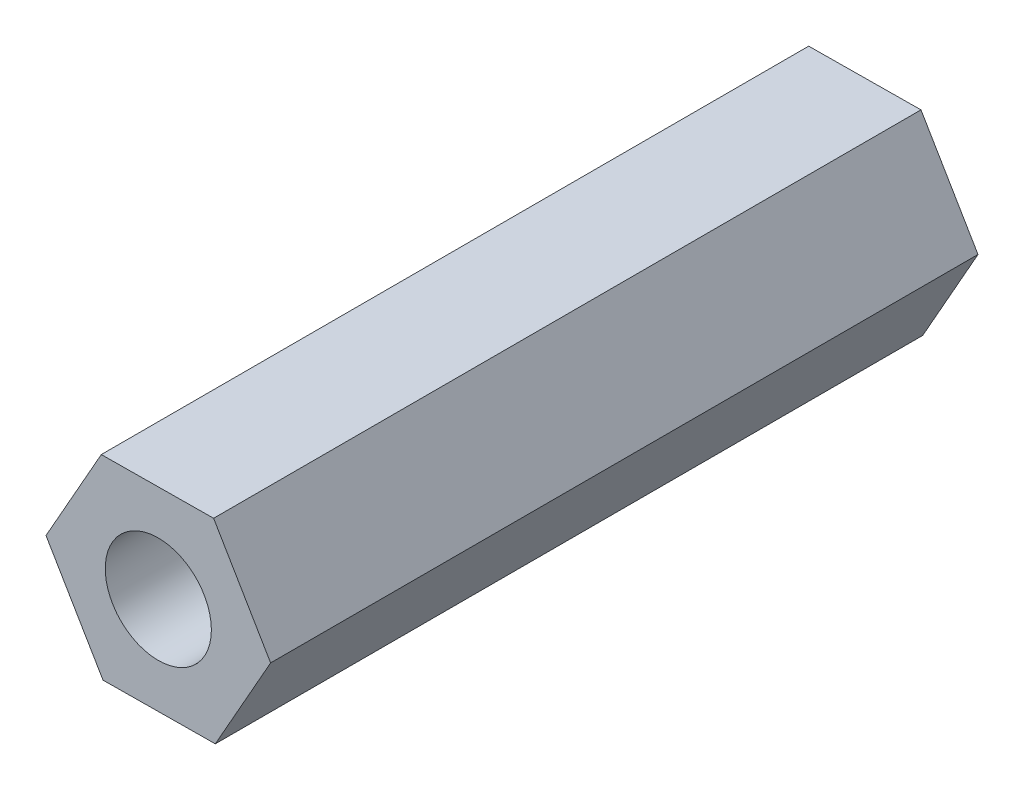
ISO-10303-21;
HEADER;
FILE_DESCRIPTION(('STEP AP214'),'2;1');
FILE_NAME('part.step','',(''),(''),'','','');
FILE_SCHEMA(('AUTOMOTIVE_DESIGN { 1 0 10303 214 1 1 1 1 }'));
ENDSEC;
DATA;
#1=APPLICATION_CONTEXT('core data for automotive mechanical design processes');
#2=APPLICATION_PROTOCOL_DEFINITION('international standard','automotive_design',2000,#1);
#3=PRODUCT_CONTEXT('',#1,'mechanical');
#4=PRODUCT('Part','Part','',(#3));
#5=PRODUCT_RELATED_PRODUCT_CATEGORY('part','',(#4));
#6=PRODUCT_DEFINITION_FORMATION('','',#4);
#7=PRODUCT_DEFINITION_CONTEXT('part definition',#1,'design');
#8=PRODUCT_DEFINITION('design','',#6,#7);
#9=PRODUCT_DEFINITION_SHAPE('','',#8);
#10=(LENGTH_UNIT() NAMED_UNIT(*) SI_UNIT(.MILLI.,.METRE.));
#11=(NAMED_UNIT(*) PLANE_ANGLE_UNIT() SI_UNIT($,.RADIAN.));
#12=(NAMED_UNIT(*) SI_UNIT($,.STERADIAN.) SOLID_ANGLE_UNIT());
#13=UNCERTAINTY_MEASURE_WITH_UNIT(LENGTH_MEASURE(1.E-05),#10,'distance_accuracy_value','');
#14=(GEOMETRIC_REPRESENTATION_CONTEXT(3) GLOBAL_UNCERTAINTY_ASSIGNED_CONTEXT((#13)) GLOBAL_UNIT_ASSIGNED_CONTEXT((#10,
#11,#12)) REPRESENTATION_CONTEXT('',''));
#15=CARTESIAN_POINT('',(0.,0.,0.));
#16=DIRECTION('',(0.,0.,1.));
#17=DIRECTION('',(1.,0.,0.));
#18=AXIS2_PLACEMENT_3D('',#15,#16,#17);
#19=CARTESIAN_POINT('',(0.,0.,20.));
#20=DIRECTION('',(0.,0.,1.));
#21=DIRECTION('',(1.,0.,0.));
#22=AXIS2_PLACEMENT_3D('',#19,#20,#21);
#23=PLANE('',#22);
#24=DIRECTION('',(0.999961257640527,0.00880245522430783,0.));
#25=VECTOR('',#24,1.);
#26=CARTESIAN_POINT('',(-1.56344497664753,-2.76386923321798,20.));
#27=LINE('',#26,#25);
#28=CARTESIAN_POINT('',(-1.56344497664753,-2.76386923321798,20.));
#29=VERTEX_POINT('',#28);
#30=CARTESIAN_POINT('',(1.61185848038122,-2.73591768380492,20.));
#31=VERTEX_POINT('',#30);
#32=EDGE_CURVE('E131',#29,#31,#27,.T.);
#33=ORIENTED_EDGE('',*,*,#32,.T.);
#34=DIRECTION('',(0.492357478980338,0.870393079529086,0.));
#35=VECTOR('',#34,1.);
#36=CARTESIAN_POINT('',(1.61185848038122,-2.73591768380492,20.));
#37=LINE('',#36,#35);
#38=CARTESIAN_POINT('',(3.17530345702875,0.0279515494130611,20.));
#39=VERTEX_POINT('',#38);
#40=EDGE_CURVE('E89',#31,#39,#37,.T.);
#41=ORIENTED_EDGE('',*,*,#40,.T.);
#42=DIRECTION('',(-0.507603778660189,0.861590624304778,0.));
#43=VECTOR('',#42,1.);
#44=CARTESIAN_POINT('',(3.17530345702875,0.0279515494130611,20.));
#45=LINE('',#44,#43);
#46=CARTESIAN_POINT('',(1.56344497664753,2.76386923321798,20.));
#47=VERTEX_POINT('',#46);
#48=EDGE_CURVE('E102',#39,#47,#45,.T.);
#49=ORIENTED_EDGE('',*,*,#48,.T.);
#50=DIRECTION('',(-0.999961257640527,-0.00880245522430783,0.));
#51=VECTOR('',#50,1.);
#52=CARTESIAN_POINT('',(1.56344497664753,2.76386923321798,20.));
#53=LINE('',#52,#51);
#54=CARTESIAN_POINT('',(-1.61185848038122,2.73591768380492,20.));
#55=VERTEX_POINT('',#54);
#56=EDGE_CURVE('E96',#47,#55,#53,.T.);
#57=ORIENTED_EDGE('',*,*,#56,.T.);
#58=DIRECTION('',(-0.492357478980338,-0.870393079529086,0.));
#59=VECTOR('',#58,1.);
#60=CARTESIAN_POINT('',(-1.61185848038122,2.73591768380492,20.));
#61=LINE('',#60,#59);
#62=CARTESIAN_POINT('',(-3.17530345702875,-0.02795154941306,20.));
#63=VERTEX_POINT('',#62);
#64=EDGE_CURVE('E100',#55,#63,#61,.T.);
#65=ORIENTED_EDGE('',*,*,#64,.T.);
#66=DIRECTION('',(0.507603778660189,-0.861590624304779,0.));
#67=VECTOR('',#66,1.);
#68=CARTESIAN_POINT('',(-3.17530345702875,-0.02795154941306,20.));
#69=LINE('',#68,#67);
#70=EDGE_CURVE('E52',#63,#29,#69,.T.);
#71=ORIENTED_EDGE('',*,*,#70,.T.);
#72=EDGE_LOOP('',(#33,#41,#49,#57,#65,#71));
#73=FACE_BOUND('',#72,.T.);
#74=CARTESIAN_POINT('',(0.,0.,20.));
#75=DIRECTION('',(0.,0.,1.));
#76=DIRECTION('',(1.,0.,0.));
#77=AXIS2_PLACEMENT_3D('',#74,#75,#76);
#78=CIRCLE('',#77,1.5);
#79=CARTESIAN_POINT('',(1.5,0.,20.));
#80=VERTEX_POINT('',#79);
#81=EDGE_CURVE('E124',#80,#80,#78,.T.);
#82=ORIENTED_EDGE('',*,*,#81,.F.);
#83=EDGE_LOOP('',(#82));
#84=FACE_BOUND('',#83,.T.);
#85=ADVANCED_FACE('F35',(#73,#84),#23,.T.);
#86=CARTESIAN_POINT('',(0.,0.,0.));
#87=DIRECTION('',(0.,0.,1.));
#88=DIRECTION('',(1.,0.,0.));
#89=AXIS2_PLACEMENT_3D('',#86,#87,#88);
#90=PLANE('',#89);
#91=DIRECTION('',(0.999961257640527,0.00880245522430783,0.));
#92=VECTOR('',#91,1.);
#93=CARTESIAN_POINT('',(-1.56344497664753,-2.76386923321798,0.));
#94=LINE('',#93,#92);
#95=CARTESIAN_POINT('',(-1.56344497664753,-2.76386923321798,0.));
#96=VERTEX_POINT('',#95);
#97=CARTESIAN_POINT('',(1.61185848038122,-2.73591768380492,0.));
#98=VERTEX_POINT('',#97);
#99=EDGE_CURVE('E120',#96,#98,#94,.T.);
#100=ORIENTED_EDGE('',*,*,#99,.F.);
#101=DIRECTION('',(0.507603778660189,-0.861590624304779,0.));
#102=VECTOR('',#101,1.);
#103=CARTESIAN_POINT('',(-3.17530345702875,-0.02795154941306,0.));
#104=LINE('',#103,#102);
#105=CARTESIAN_POINT('',(-3.17530345702875,-0.02795154941306,0.));
#106=VERTEX_POINT('',#105);
#107=EDGE_CURVE('E81',#106,#96,#104,.T.);
#108=ORIENTED_EDGE('',*,*,#107,.F.);
#109=DIRECTION('',(-0.492357478980338,-0.870393079529086,0.));
#110=VECTOR('',#109,1.);
#111=CARTESIAN_POINT('',(-1.61185848038122,2.73591768380492,0.));
#112=LINE('',#111,#110);
#113=CARTESIAN_POINT('',(-1.61185848038122,2.73591768380492,0.));
#114=VERTEX_POINT('',#113);
#115=EDGE_CURVE('E75',#114,#106,#112,.T.);
#116=ORIENTED_EDGE('',*,*,#115,.F.);
#117=DIRECTION('',(-0.999961257640527,-0.00880245522430783,0.));
#118=VECTOR('',#117,1.);
#119=CARTESIAN_POINT('',(1.56344497664753,2.76386923321798,0.));
#120=LINE('',#119,#118);
#121=CARTESIAN_POINT('',(1.56344497664753,2.76386923321798,0.));
#122=VERTEX_POINT('',#121);
#123=EDGE_CURVE('E110',#122,#114,#120,.T.);
#124=ORIENTED_EDGE('',*,*,#123,.F.);
#125=DIRECTION('',(-0.507603778660189,0.861590624304778,0.));
#126=VECTOR('',#125,1.);
#127=CARTESIAN_POINT('',(3.17530345702875,0.0279515494130611,0.));
#128=LINE('',#127,#126);
#129=CARTESIAN_POINT('',(3.17530345702875,0.0279515494130611,0.));
#130=VERTEX_POINT('',#129);
#131=EDGE_CURVE('E126',#130,#122,#128,.T.);
#132=ORIENTED_EDGE('',*,*,#131,.F.);
#133=DIRECTION('',(0.492357478980338,0.870393079529086,0.));
#134=VECTOR('',#133,1.);
#135=CARTESIAN_POINT('',(1.61185848038122,-2.73591768380492,0.));
#136=LINE('',#135,#134);
#137=EDGE_CURVE('E123',#98,#130,#136,.T.);
#138=ORIENTED_EDGE('',*,*,#137,.F.);
#139=EDGE_LOOP('',(#100,#108,#116,#124,#132,#138));
#140=FACE_BOUND('',#139,.T.);
#141=CARTESIAN_POINT('',(0.,0.,0.));
#142=DIRECTION('',(0.,0.,1.));
#143=DIRECTION('',(1.,0.,0.));
#144=AXIS2_PLACEMENT_3D('',#141,#142,#143);
#145=CIRCLE('',#144,1.5);
#146=CARTESIAN_POINT('',(1.5,0.,0.));
#147=VERTEX_POINT('',#146);
#148=EDGE_CURVE('E224',#147,#147,#145,.T.);
#149=ORIENTED_EDGE('',*,*,#148,.T.);
#150=EDGE_LOOP('',(#149));
#151=FACE_BOUND('',#150,.T.);
#152=ADVANCED_FACE('F140',(#140,#151),#90,.F.);
#153=CARTESIAN_POINT('',(-1.56344497664753,-2.76386923321798,20.));
#154=DIRECTION('',(-0.00880245522430783,0.999961257640527,0.));
#155=DIRECTION('',(-0.999961257640527,-0.00880245522430783,0.));
#156=AXIS2_PLACEMENT_3D('',#153,#154,#155);
#157=PLANE('',#156);
#158=ORIENTED_EDGE('',*,*,#99,.T.);
#159=DIRECTION('',(0.,0.,-1.));
#160=VECTOR('',#159,1.);
#161=CARTESIAN_POINT('',(1.61185848038122,-2.73591768380492,20.));
#162=LINE('',#161,#160);
#163=EDGE_CURVE('E11',#31,#98,#162,.T.);
#164=ORIENTED_EDGE('',*,*,#163,.F.);
#165=ORIENTED_EDGE('',*,*,#32,.F.);
#166=DIRECTION('',(0.,0.,-1.));
#167=VECTOR('',#166,1.);
#168=CARTESIAN_POINT('',(-1.56344497664753,-2.76386923321798,20.));
#169=LINE('',#168,#167);
#170=EDGE_CURVE('E116',#29,#96,#169,.T.);
#171=ORIENTED_EDGE('',*,*,#170,.T.);
#172=EDGE_LOOP('',(#158,#164,#165,#171));
#173=FACE_BOUND('',#172,.T.);
#174=ADVANCED_FACE('F37',(#173),#157,.F.);
#175=CARTESIAN_POINT('',(1.61185848038122,-2.73591768380492,20.));
#176=DIRECTION('',(-0.870393079529086,0.492357478980338,0.));
#177=DIRECTION('',(-0.492357478980338,-0.870393079529086,0.));
#178=AXIS2_PLACEMENT_3D('',#175,#176,#177);
#179=PLANE('',#178);
#180=ORIENTED_EDGE('',*,*,#137,.T.);
#181=DIRECTION('',(0.,0.,-1.));
#182=VECTOR('',#181,1.);
#183=CARTESIAN_POINT('',(3.17530345702875,0.0279515494130611,20.));
#184=LINE('',#183,#182);
#185=EDGE_CURVE('E44',#39,#130,#184,.T.);
#186=ORIENTED_EDGE('',*,*,#185,.F.);
#187=ORIENTED_EDGE('',*,*,#40,.F.);
#188=ORIENTED_EDGE('',*,*,#163,.T.);
#189=EDGE_LOOP('',(#180,#186,#187,#188));
#190=FACE_BOUND('',#189,.T.);
#191=ADVANCED_FACE('F165',(#190),#179,.F.);
#192=CARTESIAN_POINT('',(3.17530345702875,0.0279515494130611,20.));
#193=DIRECTION('',(-0.861590624304778,-0.507603778660189,0.));
#194=DIRECTION('',(0.507603778660189,-0.861590624304779,0.));
#195=AXIS2_PLACEMENT_3D('',#192,#193,#194);
#196=PLANE('',#195);
#197=ORIENTED_EDGE('',*,*,#131,.T.);
#198=DIRECTION('',(0.,0.,-1.));
#199=VECTOR('',#198,1.);
#200=CARTESIAN_POINT('',(1.56344497664753,2.76386923321798,20.));
#201=LINE('',#200,#199);
#202=EDGE_CURVE('E111',#47,#122,#201,.T.);
#203=ORIENTED_EDGE('',*,*,#202,.F.);
#204=ORIENTED_EDGE('',*,*,#48,.F.);
#205=ORIENTED_EDGE('',*,*,#185,.T.);
#206=EDGE_LOOP('',(#197,#203,#204,#205));
#207=FACE_BOUND('',#206,.T.);
#208=ADVANCED_FACE('F137',(#207),#196,.F.);
#209=CARTESIAN_POINT('',(1.56344497664753,2.76386923321798,20.));
#210=DIRECTION('',(0.00880245522430783,-0.999961257640527,0.));
#211=DIRECTION('',(0.999961257640527,0.00880245522430783,0.));
#212=AXIS2_PLACEMENT_3D('',#209,#210,#211);
#213=PLANE('',#212);
#214=ORIENTED_EDGE('',*,*,#123,.T.);
#215=DIRECTION('',(0.,0.,-1.));
#216=VECTOR('',#215,1.);
#217=CARTESIAN_POINT('',(-1.61185848038122,2.73591768380492,20.));
#218=LINE('',#217,#216);
#219=EDGE_CURVE('E107',#55,#114,#218,.T.);
#220=ORIENTED_EDGE('',*,*,#219,.F.);
#221=ORIENTED_EDGE('',*,*,#56,.F.);
#222=ORIENTED_EDGE('',*,*,#202,.T.);
#223=EDGE_LOOP('',(#214,#220,#221,#222));
#224=FACE_BOUND('',#223,.T.);
#225=ADVANCED_FACE('F108',(#224),#213,.F.);
#226=CARTESIAN_POINT('',(-1.61185848038122,2.73591768380492,20.));
#227=DIRECTION('',(0.870393079529086,-0.492357478980338,0.));
#228=DIRECTION('',(0.492357478980338,0.870393079529086,0.));
#229=AXIS2_PLACEMENT_3D('',#226,#227,#228);
#230=PLANE('',#229);
#231=ORIENTED_EDGE('',*,*,#115,.T.);
#232=DIRECTION('',(0.,0.,-1.));
#233=VECTOR('',#232,1.);
#234=CARTESIAN_POINT('',(-3.17530345702875,-0.02795154941306,20.));
#235=LINE('',#234,#233);
#236=EDGE_CURVE('E112',#63,#106,#235,.T.);
#237=ORIENTED_EDGE('',*,*,#236,.F.);
#238=ORIENTED_EDGE('',*,*,#64,.F.);
#239=ORIENTED_EDGE('',*,*,#219,.T.);
#240=EDGE_LOOP('',(#231,#237,#238,#239));
#241=FACE_BOUND('',#240,.T.);
#242=ADVANCED_FACE('F114',(#241),#230,.F.);
#243=CARTESIAN_POINT('',(-3.17530345702875,-0.02795154941306,20.));
#244=DIRECTION('',(0.861590624304779,0.507603778660189,0.));
#245=DIRECTION('',(-0.507603778660189,0.861590624304779,0.));
#246=AXIS2_PLACEMENT_3D('',#243,#244,#245);
#247=PLANE('',#246);
#248=ORIENTED_EDGE('',*,*,#107,.T.);
#249=ORIENTED_EDGE('',*,*,#170,.F.);
#250=ORIENTED_EDGE('',*,*,#70,.F.);
#251=ORIENTED_EDGE('',*,*,#236,.T.);
#252=EDGE_LOOP('',(#248,#249,#250,#251));
#253=FACE_BOUND('',#252,.T.);
#254=ADVANCED_FACE('F145',(#253),#247,.F.);
#255=CARTESIAN_POINT('',(0.,0.,20.));
#256=DIRECTION('',(0.,0.,-1.));
#257=DIRECTION('',(-1.,0.,0.));
#258=AXIS2_PLACEMENT_3D('',#255,#256,#257);
#259=CYLINDRICAL_SURFACE('',#258,1.5);
#260=ORIENTED_EDGE('',*,*,#81,.T.);
#261=EDGE_LOOP('',(#260));
#262=FACE_BOUND('',#261,.T.);
#263=ORIENTED_EDGE('',*,*,#148,.F.);
#264=EDGE_LOOP('',(#263));
#265=FACE_BOUND('',#264,.T.);
#266=ADVANCED_FACE('F147',(#262,#265),#259,.F.);
#267=CLOSED_SHELL('',(#85,#152,#174,#191,#208,#225,#242,#254,#266));
#268=MANIFOLD_SOLID_BREP('B2',#267);
#269=ADVANCED_BREP_SHAPE_REPRESENTATION('',(#18,#268),#14);
#270=SHAPE_DEFINITION_REPRESENTATION(#9,#269);
ENDSEC;
END-ISO-10303-21;
